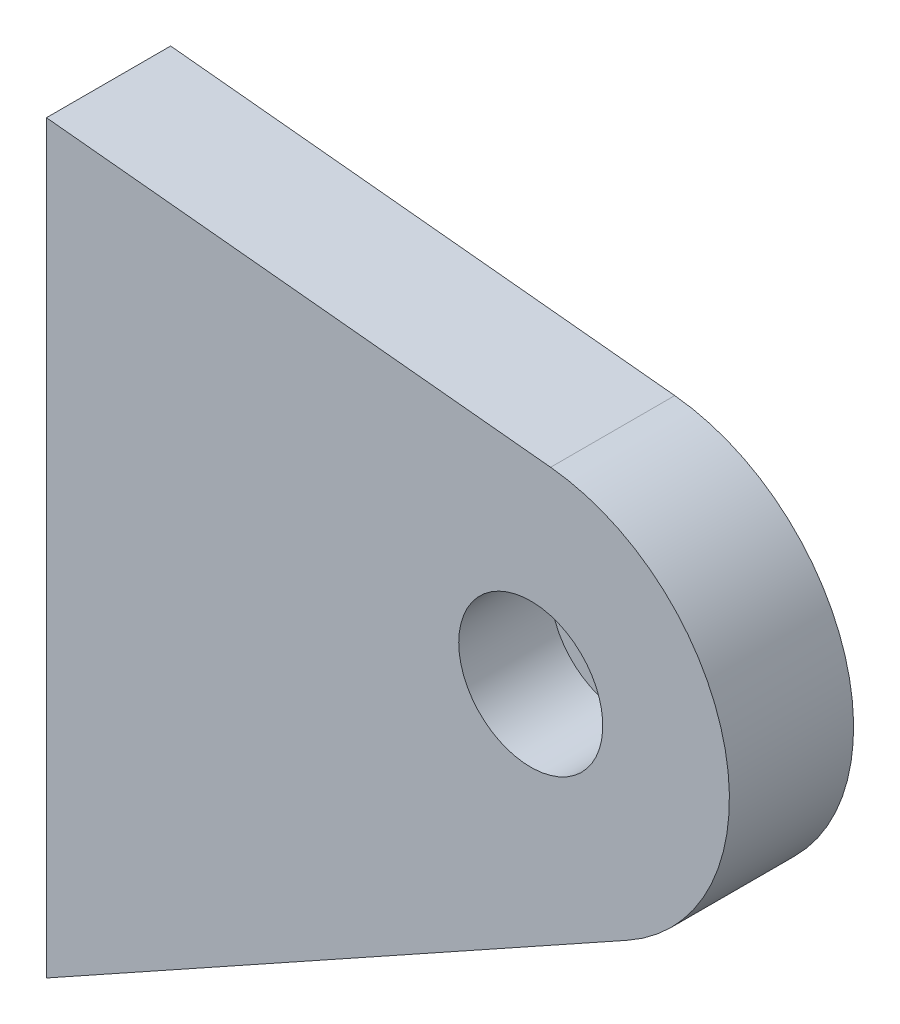
ISO-10303-21;
HEADER;
FILE_DESCRIPTION(('STEP AP214'),'2;1');
FILE_NAME('part.step','',(''),(''),'','','');
FILE_SCHEMA(('AUTOMOTIVE_DESIGN { 1 0 10303 214 1 1 1 1 }'));
ENDSEC;
DATA;
#1=APPLICATION_CONTEXT('core data for automotive mechanical design processes');
#2=APPLICATION_PROTOCOL_DEFINITION('international standard','automotive_design',2000,#1);
#3=PRODUCT_CONTEXT('',#1,'mechanical');
#4=PRODUCT('Part','Part','',(#3));
#5=PRODUCT_RELATED_PRODUCT_CATEGORY('part','',(#4));
#6=PRODUCT_DEFINITION_FORMATION('','',#4);
#7=PRODUCT_DEFINITION_CONTEXT('part definition',#1,'design');
#8=PRODUCT_DEFINITION('design','',#6,#7);
#9=PRODUCT_DEFINITION_SHAPE('','',#8);
#10=(LENGTH_UNIT() NAMED_UNIT(*) SI_UNIT(.MILLI.,.METRE.));
#11=(NAMED_UNIT(*) PLANE_ANGLE_UNIT() SI_UNIT($,.RADIAN.));
#12=(NAMED_UNIT(*) SI_UNIT($,.STERADIAN.) SOLID_ANGLE_UNIT());
#13=UNCERTAINTY_MEASURE_WITH_UNIT(LENGTH_MEASURE(1.E-05),#10,'distance_accuracy_value','');
#14=(GEOMETRIC_REPRESENTATION_CONTEXT(3) GLOBAL_UNCERTAINTY_ASSIGNED_CONTEXT((#13)) GLOBAL_UNIT_ASSIGNED_CONTEXT((#10,
#11,#12)) REPRESENTATION_CONTEXT('',''));
#15=CARTESIAN_POINT('',(0.,0.,0.));
#16=DIRECTION('',(0.,0.,1.));
#17=DIRECTION('',(1.,0.,0.));
#18=AXIS2_PLACEMENT_3D('',#15,#16,#17);
#19=CARTESIAN_POINT('',(-19.5,-20.,-5.));
#20=DIRECTION('',(-1.,0.,0.));
#21=DIRECTION('',(0.,0.,1.));
#22=AXIS2_PLACEMENT_3D('',#19,#20,#21);
#23=PLANE('',#22);
#24=CARTESIAN_POINT('',(-19.5,6.,-2.49999999999992));
#25=DIRECTION('',(-1.,0.,0.));
#26=DIRECTION('',(0.,0.,1.));
#27=AXIS2_PLACEMENT_3D('',#24,#25,#26);
#28=CIRCLE('',#27,1.24999999999999);
#29=CARTESIAN_POINT('',(-19.5,6.,-1.24999999999993));
#30=VERTEX_POINT('',#29);
#31=EDGE_CURVE('E98',#30,#30,#28,.T.);
#32=ORIENTED_EDGE('',*,*,#31,.F.);
#33=EDGE_LOOP('',(#32));
#34=FACE_BOUND('',#33,.T.);
#35=CARTESIAN_POINT('',(-19.5,-16.,-2.49999999999991));
#36=DIRECTION('',(-1.,0.,0.));
#37=DIRECTION('',(0.,0.,1.));
#38=AXIS2_PLACEMENT_3D('',#35,#36,#37);
#39=CIRCLE('',#38,1.24999999999999);
#40=CARTESIAN_POINT('',(-19.5,-16.,-1.24999999999992));
#41=VERTEX_POINT('',#40);
#42=EDGE_CURVE('E97',#41,#41,#39,.T.);
#43=ORIENTED_EDGE('',*,*,#42,.F.);
#44=EDGE_LOOP('',(#43));
#45=FACE_BOUND('',#44,.T.);
#46=DIRECTION('',(0.,-1.,0.));
#47=VECTOR('',#46,1.);
#48=CARTESIAN_POINT('',(-19.5,-20.,0.));
#49=LINE('',#48,#47);
#50=CARTESIAN_POINT('',(-19.5,10.,0.));
#51=VERTEX_POINT('',#50);
#52=CARTESIAN_POINT('',(-19.5,-20.,0.));
#53=VERTEX_POINT('',#52);
#54=EDGE_CURVE('E116',#51,#53,#49,.T.);
#55=ORIENTED_EDGE('',*,*,#54,.F.);
#56=DIRECTION('',(0.,0.,1.));
#57=VECTOR('',#56,1.);
#58=CARTESIAN_POINT('',(-19.5,10.,-5.));
#59=LINE('',#58,#57);
#60=CARTESIAN_POINT('',(-19.5,10.,-5.));
#61=VERTEX_POINT('',#60);
#62=EDGE_CURVE('E53',#61,#51,#59,.T.);
#63=ORIENTED_EDGE('',*,*,#62,.F.);
#64=DIRECTION('',(0.,-1.,0.));
#65=VECTOR('',#64,1.);
#66=CARTESIAN_POINT('',(-19.5,-20.,-5.));
#67=LINE('',#66,#65);
#68=CARTESIAN_POINT('',(-19.5,-20.,-5.));
#69=VERTEX_POINT('',#68);
#70=EDGE_CURVE('E117',#61,#69,#67,.T.);
#71=ORIENTED_EDGE('',*,*,#70,.T.);
#72=DIRECTION('',(0.,0.,1.));
#73=VECTOR('',#72,1.);
#74=CARTESIAN_POINT('',(-19.5,-20.,-5.));
#75=LINE('',#74,#73);
#76=EDGE_CURVE('E79',#69,#53,#75,.T.);
#77=ORIENTED_EDGE('',*,*,#76,.T.);
#78=EDGE_LOOP('',(#55,#63,#71,#77));
#79=FACE_BOUND('',#78,.T.);
#80=ADVANCED_FACE('F32',(#34,#45,#79),#23,.T.);
#81=CARTESIAN_POINT('',(0.799950986045296,7.95990442278833,-5.));
#82=DIRECTION('',(0.0999938732556618,0.994988052848541,0.));
#83=DIRECTION('',(-0.994988052848541,0.0999938732556618,0.));
#84=AXIS2_PLACEMENT_3D('',#81,#82,#83);
#85=PLANE('',#84);
#86=DIRECTION('',(-0.994988052848541,0.0999938732556618,0.));
#87=VECTOR('',#86,1.);
#88=CARTESIAN_POINT('',(0.799950986045296,7.95990442278833,0.));
#89=LINE('',#88,#87);
#90=CARTESIAN_POINT('',(0.799950986045296,7.95990442278833,0.));
#91=VERTEX_POINT('',#90);
#92=EDGE_CURVE('E120',#91,#51,#89,.T.);
#93=ORIENTED_EDGE('',*,*,#92,.F.);
#94=DIRECTION('',(0.,0.,1.));
#95=VECTOR('',#94,1.);
#96=CARTESIAN_POINT('',(0.799950986045296,7.95990442278833,-5.));
#97=LINE('',#96,#95);
#98=CARTESIAN_POINT('',(0.799950986045296,7.95990442278833,-5.));
#99=VERTEX_POINT('',#98);
#100=EDGE_CURVE('E138',#99,#91,#97,.T.);
#101=ORIENTED_EDGE('',*,*,#100,.F.);
#102=DIRECTION('',(-0.994988052848541,0.0999938732556618,0.));
#103=VECTOR('',#102,1.);
#104=CARTESIAN_POINT('',(0.799950986045296,7.95990442278833,-5.));
#105=LINE('',#104,#103);
#106=EDGE_CURVE('E125',#99,#61,#105,.T.);
#107=ORIENTED_EDGE('',*,*,#106,.T.);
#108=ORIENTED_EDGE('',*,*,#62,.T.);
#109=EDGE_LOOP('',(#93,#101,#107,#108));
#110=FACE_BOUND('',#109,.T.);
#111=ADVANCED_FACE('F176',(#110),#85,.T.);
#112=CARTESIAN_POINT('',(0.,0.,-5.));
#113=DIRECTION('',(0.,0.,1.));
#114=DIRECTION('',(1.,0.,0.));
#115=AXIS2_PLACEMENT_3D('',#112,#113,#114);
#116=CYLINDRICAL_SURFACE('',#115,8.);
#117=CARTESIAN_POINT('',(0.,0.,0.));
#118=DIRECTION('',(0.,0.,1.));
#119=DIRECTION('',(-1.,0.,0.));
#120=AXIS2_PLACEMENT_3D('',#117,#118,#119);
#121=CIRCLE('',#120,8.);
#122=CARTESIAN_POINT('',(3.88856851155815,-6.99135429876919,0.));
#123=VERTEX_POINT('',#122);
#124=EDGE_CURVE('E132',#123,#91,#121,.T.);
#125=ORIENTED_EDGE('',*,*,#124,.F.);
#126=DIRECTION('',(0.,0.,1.));
#127=VECTOR('',#126,1.);
#128=CARTESIAN_POINT('',(3.88856851155815,-6.99135429876919,-5.));
#129=LINE('',#128,#127);
#130=CARTESIAN_POINT('',(3.88856851155815,-6.99135429876919,-5.));
#131=VERTEX_POINT('',#130);
#132=EDGE_CURVE('E140',#131,#123,#129,.T.);
#133=ORIENTED_EDGE('',*,*,#132,.F.);
#134=CARTESIAN_POINT('',(0.,0.,-5.));
#135=DIRECTION('',(0.,0.,1.));
#136=DIRECTION('',(-1.,0.,0.));
#137=AXIS2_PLACEMENT_3D('',#134,#135,#136);
#138=CIRCLE('',#137,8.);
#139=EDGE_CURVE('E122',#131,#99,#138,.T.);
#140=ORIENTED_EDGE('',*,*,#139,.T.);
#141=ORIENTED_EDGE('',*,*,#100,.T.);
#142=EDGE_LOOP('',(#125,#133,#140,#141));
#143=FACE_BOUND('',#142,.T.);
#144=ADVANCED_FACE('F178',(#143),#116,.T.);
#145=CARTESIAN_POINT('',(3.88856851155814,-6.99135429876919,-5.));
#146=DIRECTION('',(0.486071063944768,-0.873919287346149,0.));
#147=DIRECTION('',(0.873919287346149,0.486071063944768,0.));
#148=AXIS2_PLACEMENT_3D('',#145,#146,#147);
#149=PLANE('',#148);
#150=CARTESIAN_POINT('',(-12.3083002493195,-16.,-2.49999999999991));
#151=DIRECTION('',(0.486071063944768,-0.873919287346149,0.));
#152=DIRECTION('',(-0.873919287346149,-0.486071063944768,0.));
#153=AXIS2_PLACEMENT_3D('',#150,#151,#152);
#154=ELLIPSE('',#153,2.57164043021912,1.24999999999999);
#155=CARTESIAN_POINT('',(-10.4,-14.9386096108148,-1.83973456720392));
#156=VERTEX_POINT('',#155);
#157=CARTESIAN_POINT('',(-10.4,-14.9386096108148,-3.1602654327959));
#158=VERTEX_POINT('',#157);
#159=EDGE_CURVE('E11',#156,#158,#154,.T.);
#160=ORIENTED_EDGE('',*,*,#159,.F.);
#161=CARTESIAN_POINT('',(-10.4002,-14.938720850164,-3.16107398727941));
#162=CARTESIAN_POINT('',(-10.3865373088261,-14.9311217057906,-3.10591443878529));
#163=CARTESIAN_POINT('',(-10.3742295070948,-14.9242761465164,-3.05028007563566));
#164=CARTESIAN_POINT('',(-10.3527627220885,-14.9123363905475,-2.93814873538049));
#165=CARTESIAN_POINT('',(-10.3436079695367,-14.9072445469672,-2.88165070469042));
#166=CARTESIAN_POINT('',(-10.3290824102209,-14.8991654781409,-2.76924334658398));
#167=CARTESIAN_POINT('',(-10.3236348067678,-14.8961355388265,-2.71334730163797));
#168=CARTESIAN_POINT('',(-10.3165106353581,-14.89217309787,-2.60127423585338));
#169=CARTESIAN_POINT('',(-10.3148315414652,-14.8912391913104,-2.54509742852945));
#170=CARTESIAN_POINT('',(-10.3153279856908,-14.8915153119733,-2.43457197038633));
#171=CARTESIAN_POINT('',(-10.3173814753058,-14.8926574562152,-2.38022254224069));
#172=CARTESIAN_POINT('',(-10.3249949145194,-14.8968920263322,-2.27181667796143));
#173=CARTESIAN_POINT('',(-10.3305570162129,-14.8999856491954,-2.21776044220443));
#174=CARTESIAN_POINT('',(-10.3450621660613,-14.9080533663422,-2.10908513630529));
#175=CARTESIAN_POINT('',(-10.3540743300129,-14.9130659026071,-2.05447839590214));
#176=CARTESIAN_POINT('',(-10.3750380951313,-14.9247258805513,-1.94607654681008));
#177=CARTESIAN_POINT('',(-10.3869859680077,-14.9313712485675,-1.89228049981768));
#178=CARTESIAN_POINT('',(-10.4002,-14.938720850164,-1.83892601272037));
#179=B_SPLINE_CURVE_WITH_KNOTS('',3,(#161,#162,#163,#164,#165,#166,#167,#168,#169,#170,#171,
#172,#173,#174,#175,#176,#177,#178),.UNSPECIFIED.,.F.,.F.,(4,2,2,2,2,2,2,2,4),(0.,
0.172025774533773,0.34428148004073,0.512850265496038,0.681306029785519,0.844352342148432,
1.00749876041514,1.17410074779721,1.34049223782756),.UNSPECIFIED.);
#180=EDGE_CURVE('E39',#158,#156,#179,.T.);
#181=ORIENTED_EDGE('',*,*,#180,.F.);
#182=EDGE_LOOP('',(#160,#181));
#183=FACE_BOUND('',#182,.T.);
#184=DIRECTION('',(0.873919287346149,0.486071063944768,0.));
#185=VECTOR('',#184,1.);
#186=CARTESIAN_POINT('',(3.88856851155814,-6.99135429876919,0.));
#187=LINE('',#186,#185);
#188=EDGE_CURVE('E129',#53,#123,#187,.T.);
#189=ORIENTED_EDGE('',*,*,#188,.F.);
#190=ORIENTED_EDGE('',*,*,#76,.F.);
#191=DIRECTION('',(0.873919287346149,0.486071063944768,0.));
#192=VECTOR('',#191,1.);
#193=CARTESIAN_POINT('',(3.88856851155814,-6.99135429876919,-5.));
#194=LINE('',#193,#192);
#195=EDGE_CURVE('E119',#69,#131,#194,.T.);
#196=ORIENTED_EDGE('',*,*,#195,.T.);
#197=ORIENTED_EDGE('',*,*,#132,.T.);
#198=EDGE_LOOP('',(#189,#190,#196,#197));
#199=FACE_BOUND('',#198,.T.);
#200=ADVANCED_FACE('F148',(#183,#199),#149,.T.);
#201=CARTESIAN_POINT('',(0.,0.,-5.));
#202=DIRECTION('',(0.,0.,-1.));
#203=DIRECTION('',(-1.,0.,0.));
#204=AXIS2_PLACEMENT_3D('',#201,#202,#203);
#205=PLANE('',#204);
#206=CARTESIAN_POINT('',(0.,0.,-5.));
#207=DIRECTION('',(0.,0.,1.));
#208=DIRECTION('',(1.,0.,0.));
#209=AXIS2_PLACEMENT_3D('',#206,#207,#208);
#210=CIRCLE('',#209,1.5);
#211=CARTESIAN_POINT('',(1.5,0.,-5.));
#212=VERTEX_POINT('',#211);
#213=EDGE_CURVE('E113',#212,#212,#210,.T.);
#214=ORIENTED_EDGE('',*,*,#213,.T.);
#215=EDGE_LOOP('',(#214));
#216=FACE_BOUND('',#215,.T.);
#217=ORIENTED_EDGE('',*,*,#70,.F.);
#218=ORIENTED_EDGE('',*,*,#106,.F.);
#219=ORIENTED_EDGE('',*,*,#139,.F.);
#220=ORIENTED_EDGE('',*,*,#195,.F.);
#221=EDGE_LOOP('',(#217,#218,#219,#220));
#222=FACE_BOUND('',#221,.T.);
#223=ADVANCED_FACE('F169',(#216,#222),#205,.T.);
#224=CARTESIAN_POINT('',(0.,0.,0.));
#225=DIRECTION('',(0.,0.,-1.));
#226=DIRECTION('',(-1.,0.,0.));
#227=AXIS2_PLACEMENT_3D('',#224,#225,#226);
#228=PLANE('',#227);
#229=CARTESIAN_POINT('',(0.,1.29044775582307E-12,0.));
#230=DIRECTION('',(0.,0.,-1.));
#231=DIRECTION('',(-1.,0.,0.));
#232=AXIS2_PLACEMENT_3D('',#229,#230,#231);
#233=CIRCLE('',#232,2.8999999999996);
#234=CARTESIAN_POINT('',(-2.8999999999996,1.29044775582307E-12,0.));
#235=VERTEX_POINT('',#234);
#236=EDGE_CURVE('E107',#235,#235,#233,.T.);
#237=ORIENTED_EDGE('',*,*,#236,.T.);
#238=EDGE_LOOP('',(#237));
#239=FACE_BOUND('',#238,.T.);
#240=ORIENTED_EDGE('',*,*,#54,.T.);
#241=ORIENTED_EDGE('',*,*,#188,.T.);
#242=ORIENTED_EDGE('',*,*,#124,.T.);
#243=ORIENTED_EDGE('',*,*,#92,.T.);
#244=EDGE_LOOP('',(#240,#241,#242,#243));
#245=FACE_BOUND('',#244,.T.);
#246=ADVANCED_FACE('F167',(#239,#245),#228,.F.);
#247=CARTESIAN_POINT('',(0.,0.,-5.));
#248=DIRECTION('',(0.,0.,1.));
#249=DIRECTION('',(1.,0.,0.));
#250=AXIS2_PLACEMENT_3D('',#247,#248,#249);
#251=CYLINDRICAL_SURFACE('',#250,1.5);
#252=CARTESIAN_POINT('',(0.,0.,-3.69999999999985));
#253=DIRECTION('',(0.,0.,-1.));
#254=DIRECTION('',(-1.,0.,0.));
#255=AXIS2_PLACEMENT_3D('',#252,#253,#254);
#256=CIRCLE('',#255,1.5);
#257=CARTESIAN_POINT('',(-1.5,0.,-3.69999999999985));
#258=VERTEX_POINT('',#257);
#259=EDGE_CURVE('E110',#258,#258,#256,.F.);
#260=ORIENTED_EDGE('',*,*,#259,.T.);
#261=EDGE_LOOP('',(#260));
#262=FACE_BOUND('',#261,.T.);
#263=ORIENTED_EDGE('',*,*,#213,.F.);
#264=EDGE_LOOP('',(#263));
#265=FACE_BOUND('',#264,.T.);
#266=ADVANCED_FACE('F160',(#262,#265),#251,.F.);
#267=CARTESIAN_POINT('',(0.,1.29016663175479E-12,-3.69999999999985));
#268=DIRECTION('',(0.,0.,-1.));
#269=DIRECTION('',(-1.,0.,0.));
#270=AXIS2_PLACEMENT_3D('',#267,#268,#269);
#271=PLANE('',#270);
#272=CARTESIAN_POINT('',(0.,1.29016663175479E-12,-3.69999999999985));
#273=DIRECTION('',(0.,0.,-1.));
#274=DIRECTION('',(-1.,0.,0.));
#275=AXIS2_PLACEMENT_3D('',#272,#273,#274);
#276=CIRCLE('',#275,2.8999999999996);
#277=CARTESIAN_POINT('',(-2.8999999999996,1.29016663175479E-12,-3.69999999999984));
#278=VERTEX_POINT('',#277);
#279=EDGE_CURVE('E106',#278,#278,#276,.T.);
#280=ORIENTED_EDGE('',*,*,#279,.F.);
#281=EDGE_LOOP('',(#280));
#282=FACE_BOUND('',#281,.T.);
#283=ORIENTED_EDGE('',*,*,#259,.F.);
#284=EDGE_LOOP('',(#283));
#285=FACE_BOUND('',#284,.T.);
#286=ADVANCED_FACE('F157',(#282,#285),#271,.F.);
#287=CARTESIAN_POINT('',(0.,1.29044775582307E-12,0.));
#288=DIRECTION('',(0.,0.,-1.));
#289=DIRECTION('',(-1.,0.,0.));
#290=AXIS2_PLACEMENT_3D('',#287,#288,#289);
#291=CYLINDRICAL_SURFACE('',#290,2.8999999999996);
#292=ORIENTED_EDGE('',*,*,#236,.F.);
#293=EDGE_LOOP('',(#292));
#294=FACE_BOUND('',#293,.T.);
#295=ORIENTED_EDGE('',*,*,#279,.T.);
#296=EDGE_LOOP('',(#295));
#297=FACE_BOUND('',#296,.T.);
#298=ADVANCED_FACE('F156',(#294,#297),#291,.F.);
#299=CARTESIAN_POINT('',(-10.4,-16.,-2.49999999999991));
#300=DIRECTION('',(-1.,0.,0.));
#301=DIRECTION('',(0.,0.,1.));
#302=AXIS2_PLACEMENT_3D('',#299,#300,#301);
#303=CONICAL_SURFACE('',#302,1.24999999999999,1.02974425867665);
#304=ORIENTED_EDGE('',*,*,#180,.T.);
#305=CARTESIAN_POINT('',(-10.4,-16.,-2.49999999999991));
#306=DIRECTION('',(-1.,0.,0.));
#307=DIRECTION('',(0.,0.,1.));
#308=AXIS2_PLACEMENT_3D('',#305,#306,#307);
#309=CIRCLE('',#308,1.24999999999999);
#310=EDGE_CURVE('E45',#156,#158,#309,.T.);
#311=ORIENTED_EDGE('',*,*,#310,.T.);
#312=EDGE_LOOP('',(#304,#311));
#313=FACE_BOUND('',#312,.T.);
#314=ADVANCED_FACE('F151',(#313),#303,.F.);
#315=CARTESIAN_POINT('',(-19.5,-16.,-2.49999999999991));
#316=DIRECTION('',(-1.,0.,0.));
#317=DIRECTION('',(0.,0.,1.));
#318=AXIS2_PLACEMENT_3D('',#315,#316,#317);
#319=CYLINDRICAL_SURFACE('',#318,1.24999999999999);
#320=ORIENTED_EDGE('',*,*,#159,.T.);
#321=ORIENTED_EDGE('',*,*,#310,.F.);
#322=EDGE_LOOP('',(#320,#321));
#323=FACE_BOUND('',#322,.T.);
#324=ORIENTED_EDGE('',*,*,#42,.T.);
#325=EDGE_LOOP('',(#324));
#326=FACE_BOUND('',#325,.T.);
#327=ADVANCED_FACE('F91',(#323,#326),#319,.F.);
#328=CARTESIAN_POINT('',(-10.4,6.,-2.49999999999992));
#329=DIRECTION('',(-1.,0.,0.));
#330=DIRECTION('',(0.,0.,1.));
#331=AXIS2_PLACEMENT_3D('',#328,#329,#330);
#332=CONICAL_SURFACE('',#331,1.24999999999999,1.02974425867665);
#333=CARTESIAN_POINT('',(-9.64892422621556,6.,-2.49999999999992));
#334=VERTEX_POINT('',#333);
#335=VERTEX_LOOP('',#334);
#336=FACE_BOUND('',#335,.T.);
#337=CARTESIAN_POINT('',(-10.4,6.,-2.49999999999992));
#338=DIRECTION('',(-1.,0.,0.));
#339=DIRECTION('',(0.,0.,1.));
#340=AXIS2_PLACEMENT_3D('',#337,#338,#339);
#341=CIRCLE('',#340,1.24999999999999);
#342=CARTESIAN_POINT('',(-10.4,6.,-1.24999999999993));
#343=VERTEX_POINT('',#342);
#344=EDGE_CURVE('E95',#343,#343,#341,.T.);
#345=ORIENTED_EDGE('',*,*,#344,.T.);
#346=EDGE_LOOP('',(#345));
#347=FACE_BOUND('',#346,.T.);
#348=ADVANCED_FACE('F87',(#336,#347),#332,.F.);
#349=CARTESIAN_POINT('',(-19.5,6.,-2.49999999999992));
#350=DIRECTION('',(-1.,0.,0.));
#351=DIRECTION('',(0.,0.,1.));
#352=AXIS2_PLACEMENT_3D('',#349,#350,#351);
#353=CYLINDRICAL_SURFACE('',#352,1.24999999999999);
#354=ORIENTED_EDGE('',*,*,#344,.F.);
#355=EDGE_LOOP('',(#354));
#356=FACE_BOUND('',#355,.T.);
#357=ORIENTED_EDGE('',*,*,#31,.T.);
#358=EDGE_LOOP('',(#357));
#359=FACE_BOUND('',#358,.T.);
#360=ADVANCED_FACE('F90',(#356,#359),#353,.F.);
#361=CLOSED_SHELL('',(#80,#111,#144,#200,#223,#246,#266,#286,#298,#314,#327,#348,#360));
#362=MANIFOLD_SOLID_BREP('B2',#361);
#363=ADVANCED_BREP_SHAPE_REPRESENTATION('',(#18,#362),#14);
#364=SHAPE_DEFINITION_REPRESENTATION(#9,#363);
ENDSEC;
END-ISO-10303-21;
